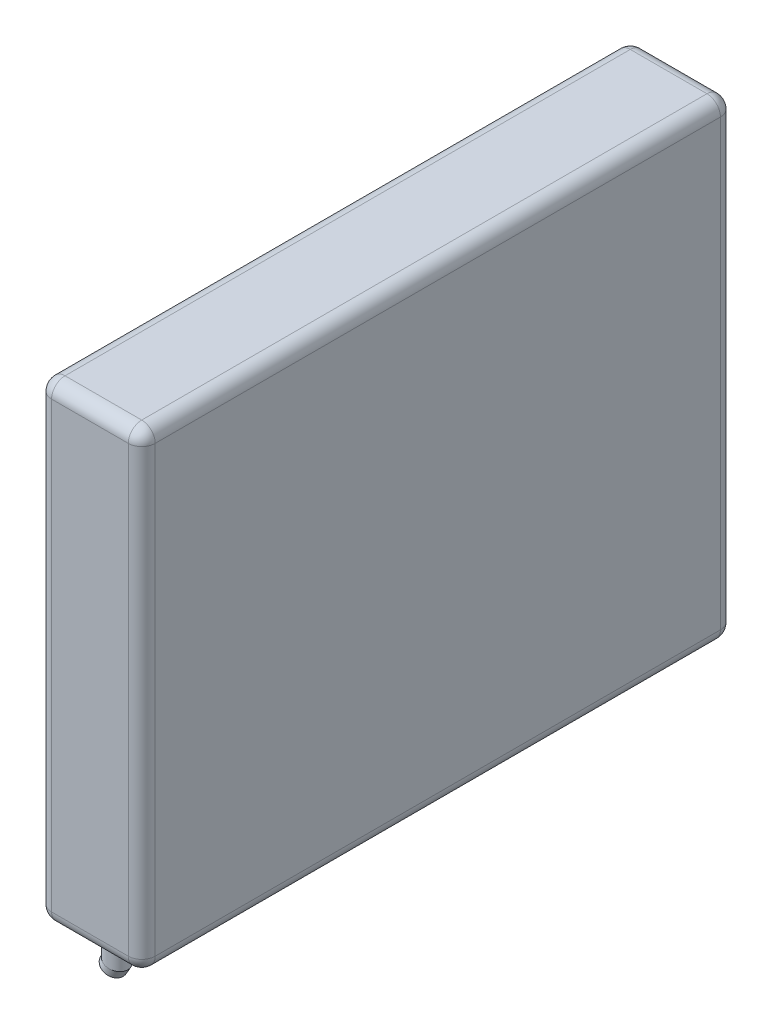
ISO-10303-21;
HEADER;
FILE_DESCRIPTION(('STEP AP214'),'2;1');
FILE_NAME('part.step','',(''),(''),'','','');
FILE_SCHEMA(('AUTOMOTIVE_DESIGN { 1 0 10303 214 1 1 1 1 }'));
ENDSEC;
DATA;
#1=APPLICATION_CONTEXT('core data for automotive mechanical design processes');
#2=APPLICATION_PROTOCOL_DEFINITION('international standard','automotive_design',2000,#1);
#3=PRODUCT_CONTEXT('',#1,'mechanical');
#4=PRODUCT('Part','Part','',(#3));
#5=PRODUCT_RELATED_PRODUCT_CATEGORY('part','',(#4));
#6=PRODUCT_DEFINITION_FORMATION('','',#4);
#7=PRODUCT_DEFINITION_CONTEXT('part definition',#1,'design');
#8=PRODUCT_DEFINITION('design','',#6,#7);
#9=PRODUCT_DEFINITION_SHAPE('','',#8);
#10=(LENGTH_UNIT() NAMED_UNIT(*) SI_UNIT(.MILLI.,.METRE.));
#11=(NAMED_UNIT(*) PLANE_ANGLE_UNIT() SI_UNIT($,.RADIAN.));
#12=(NAMED_UNIT(*) SI_UNIT($,.STERADIAN.) SOLID_ANGLE_UNIT());
#13=UNCERTAINTY_MEASURE_WITH_UNIT(LENGTH_MEASURE(1.E-05),#10,'distance_accuracy_value','');
#14=(GEOMETRIC_REPRESENTATION_CONTEXT(3) GLOBAL_UNCERTAINTY_ASSIGNED_CONTEXT((#13)) GLOBAL_UNIT_ASSIGNED_CONTEXT((#10,
#11,#12)) REPRESENTATION_CONTEXT('',''));
#15=CARTESIAN_POINT('',(0.,0.,0.));
#16=DIRECTION('',(0.,0.,1.));
#17=DIRECTION('',(1.,0.,0.));
#18=AXIS2_PLACEMENT_3D('',#15,#16,#17);
#19=CARTESIAN_POINT('',(1.925,-8.75,-11.));
#20=DIRECTION('',(0.,0.,1.));
#21=DIRECTION('',(0.,-1.,0.));
#22=AXIS2_PLACEMENT_3D('',#19,#20,#21);
#23=PLANE('',#22);
#24=DIRECTION('',(0.,1.,0.));
#25=VECTOR('',#24,1.);
#26=CARTESIAN_POINT('',(1.425,-8.75,-11.));
#27=LINE('',#26,#25);
#28=CARTESIAN_POINT('',(1.425,8.25,-11.));
#29=VERTEX_POINT('',#28);
#30=CARTESIAN_POINT('',(1.425,-8.25,-11.));
#31=VERTEX_POINT('',#30);
#32=EDGE_CURVE('E164',#29,#31,#27,.F.);
#33=ORIENTED_EDGE('',*,*,#32,.T.);
#34=DIRECTION('',(-1.,0.,0.));
#35=VECTOR('',#34,1.);
#36=CARTESIAN_POINT('',(1.925,-8.25,-11.));
#37=LINE('',#36,#35);
#38=CARTESIAN_POINT('',(-1.425,-8.25,-11.));
#39=VERTEX_POINT('',#38);
#40=EDGE_CURVE('E168',#31,#39,#37,.T.);
#41=ORIENTED_EDGE('',*,*,#40,.T.);
#42=DIRECTION('',(0.,1.,0.));
#43=VECTOR('',#42,1.);
#44=CARTESIAN_POINT('',(-1.425,8.75,-11.));
#45=LINE('',#44,#43);
#46=CARTESIAN_POINT('',(-1.425,8.25,-11.));
#47=VERTEX_POINT('',#46);
#48=EDGE_CURVE('E137',#39,#47,#45,.T.);
#49=ORIENTED_EDGE('',*,*,#48,.T.);
#50=DIRECTION('',(-1.,0.,0.));
#51=VECTOR('',#50,1.);
#52=CARTESIAN_POINT('',(1.925,8.25,-11.));
#53=LINE('',#52,#51);
#54=EDGE_CURVE('E158',#47,#29,#53,.F.);
#55=ORIENTED_EDGE('',*,*,#54,.T.);
#56=EDGE_LOOP('',(#33,#41,#49,#55));
#57=FACE_BOUND('',#56,.T.);
#58=ADVANCED_FACE('F39',(#57),#23,.F.);
#59=CARTESIAN_POINT('',(1.925,8.74999999999999,11.));
#60=DIRECTION('',(0.,-1.,0.));
#61=DIRECTION('',(0.,0.,-1.));
#62=AXIS2_PLACEMENT_3D('',#59,#60,#61);
#63=PLANE('',#62);
#64=DIRECTION('',(0.,0.,1.));
#65=VECTOR('',#64,1.);
#66=CARTESIAN_POINT('',(1.425,8.74999999999999,11.));
#67=LINE('',#66,#65);
#68=CARTESIAN_POINT('',(1.425,8.74999999999999,10.5));
#69=VERTEX_POINT('',#68);
#70=CARTESIAN_POINT('',(1.425,8.75,-10.5));
#71=VERTEX_POINT('',#70);
#72=EDGE_CURVE('E193',#69,#71,#67,.F.);
#73=ORIENTED_EDGE('',*,*,#72,.T.);
#74=DIRECTION('',(-1.,0.,0.));
#75=VECTOR('',#74,1.);
#76=CARTESIAN_POINT('',(1.925,8.75,-10.5));
#77=LINE('',#76,#75);
#78=CARTESIAN_POINT('',(-1.425,8.75,-10.5));
#79=VERTEX_POINT('',#78);
#80=EDGE_CURVE('E200',#71,#79,#77,.T.);
#81=ORIENTED_EDGE('',*,*,#80,.T.);
#82=DIRECTION('',(0.,0.,1.));
#83=VECTOR('',#82,1.);
#84=CARTESIAN_POINT('',(-1.425,8.74999999999999,11.));
#85=LINE('',#84,#83);
#86=CARTESIAN_POINT('',(-1.425,8.74999999999999,10.5));
#87=VERTEX_POINT('',#86);
#88=EDGE_CURVE('E196',#79,#87,#85,.T.);
#89=ORIENTED_EDGE('',*,*,#88,.T.);
#90=DIRECTION('',(-1.,0.,0.));
#91=VECTOR('',#90,1.);
#92=CARTESIAN_POINT('',(1.925,8.74999999999999,10.5));
#93=LINE('',#92,#91);
#94=EDGE_CURVE('E190',#87,#69,#93,.F.);
#95=ORIENTED_EDGE('',*,*,#94,.T.);
#96=EDGE_LOOP('',(#73,#81,#89,#95));
#97=FACE_BOUND('',#96,.T.);
#98=ADVANCED_FACE('F370',(#97),#63,.F.);
#99=CARTESIAN_POINT('',(1.925,-8.75000000000001,11.));
#100=DIRECTION('',(0.,0.,-1.));
#101=DIRECTION('',(0.,1.,0.));
#102=AXIS2_PLACEMENT_3D('',#99,#100,#101);
#103=PLANE('',#102);
#104=DIRECTION('',(0.,-1.,0.));
#105=VECTOR('',#104,1.);
#106=CARTESIAN_POINT('',(-1.425,-8.75000000000001,11.));
#107=LINE('',#106,#105);
#108=CARTESIAN_POINT('',(-1.425,8.24999999999999,11.));
#109=VERTEX_POINT('',#108);
#110=CARTESIAN_POINT('',(-1.425,-8.25000000000001,11.));
#111=VERTEX_POINT('',#110);
#112=EDGE_CURVE('E209',#109,#111,#107,.T.);
#113=ORIENTED_EDGE('',*,*,#112,.T.);
#114=DIRECTION('',(-1.,0.,0.));
#115=VECTOR('',#114,1.);
#116=CARTESIAN_POINT('',(1.925,-8.25000000000001,11.));
#117=LINE('',#116,#115);
#118=CARTESIAN_POINT('',(1.425,-8.25000000000001,11.));
#119=VERTEX_POINT('',#118);
#120=EDGE_CURVE('E212',#111,#119,#117,.F.);
#121=ORIENTED_EDGE('',*,*,#120,.T.);
#122=DIRECTION('',(0.,-1.,0.));
#123=VECTOR('',#122,1.);
#124=CARTESIAN_POINT('',(1.425,-8.75000000000001,11.));
#125=LINE('',#124,#123);
#126=CARTESIAN_POINT('',(1.425,8.24999999999999,11.));
#127=VERTEX_POINT('',#126);
#128=EDGE_CURVE('E206',#119,#127,#125,.F.);
#129=ORIENTED_EDGE('',*,*,#128,.T.);
#130=DIRECTION('',(-1.,0.,0.));
#131=VECTOR('',#130,1.);
#132=CARTESIAN_POINT('',(1.925,8.24999999999999,11.));
#133=LINE('',#132,#131);
#134=EDGE_CURVE('E203',#127,#109,#133,.T.);
#135=ORIENTED_EDGE('',*,*,#134,.T.);
#136=EDGE_LOOP('',(#113,#121,#129,#135));
#137=FACE_BOUND('',#136,.T.);
#138=ADVANCED_FACE('F347',(#137),#103,.F.);
#139=CARTESIAN_POINT('',(1.925,-8.75000000000001,11.));
#140=DIRECTION('',(0.,1.,0.));
#141=DIRECTION('',(0.,0.,1.));
#142=AXIS2_PLACEMENT_3D('',#139,#140,#141);
#143=PLANE('',#142);
#144=CARTESIAN_POINT('',(0.,-8.75000000000001,-10.));
#145=DIRECTION('',(0.,1.,0.));
#146=DIRECTION('',(0.,0.,1.));
#147=AXIS2_PLACEMENT_3D('',#144,#145,#146);
#148=CIRCLE('',#147,0.4064);
#149=CARTESIAN_POINT('',(0.,-8.75000000000001,-9.5936));
#150=VERTEX_POINT('',#149);
#151=EDGE_CURVE('E332',#150,#150,#148,.F.);
#152=ORIENTED_EDGE('',*,*,#151,.F.);
#153=EDGE_LOOP('',(#152));
#154=FACE_BOUND('',#153,.T.);
#155=DIRECTION('',(0.,0.,-1.));
#156=VECTOR('',#155,1.);
#157=CARTESIAN_POINT('',(-1.425,-8.75,-11.));
#158=LINE('',#157,#156);
#159=CARTESIAN_POINT('',(-1.425,-8.75000000000001,10.5));
#160=VERTEX_POINT('',#159);
#161=CARTESIAN_POINT('',(-1.425,-8.75,-10.5));
#162=VERTEX_POINT('',#161);
#163=EDGE_CURVE('E220',#160,#162,#158,.T.);
#164=ORIENTED_EDGE('',*,*,#163,.T.);
#165=DIRECTION('',(-1.,0.,0.));
#166=VECTOR('',#165,1.);
#167=CARTESIAN_POINT('',(1.925,-8.75,-10.5));
#168=LINE('',#167,#166);
#169=CARTESIAN_POINT('',(1.425,-8.75,-10.5));
#170=VERTEX_POINT('',#169);
#171=EDGE_CURVE('E224',#162,#170,#168,.F.);
#172=ORIENTED_EDGE('',*,*,#171,.T.);
#173=DIRECTION('',(0.,0.,-1.));
#174=VECTOR('',#173,1.);
#175=CARTESIAN_POINT('',(1.425,-8.75000000000001,11.));
#176=LINE('',#175,#174);
#177=CARTESIAN_POINT('',(1.425,-8.75000000000001,10.5));
#178=VERTEX_POINT('',#177);
#179=EDGE_CURVE('E218',#170,#178,#176,.F.);
#180=ORIENTED_EDGE('',*,*,#179,.T.);
#181=DIRECTION('',(-1.,0.,0.));
#182=VECTOR('',#181,1.);
#183=CARTESIAN_POINT('',(1.925,-8.75000000000001,10.5));
#184=LINE('',#183,#182);
#185=EDGE_CURVE('E215',#178,#160,#184,.T.);
#186=ORIENTED_EDGE('',*,*,#185,.T.);
#187=EDGE_LOOP('',(#164,#172,#180,#186));
#188=FACE_BOUND('',#187,.T.);
#189=CARTESIAN_POINT('',(0.,-8.75000000000001,10.));
#190=DIRECTION('',(0.,-1.,0.));
#191=DIRECTION('',(0.,0.,-1.));
#192=AXIS2_PLACEMENT_3D('',#189,#190,#191);
#193=CIRCLE('',#192,0.4064);
#194=CARTESIAN_POINT('',(0.,-8.75000000000001,9.5936));
#195=VERTEX_POINT('',#194);
#196=EDGE_CURVE('E317',#195,#195,#193,.T.);
#197=ORIENTED_EDGE('',*,*,#196,.F.);
#198=EDGE_LOOP('',(#197));
#199=FACE_BOUND('',#198,.T.);
#200=ADVANCED_FACE('F343',(#154,#188,#199),#143,.F.);
#201=CARTESIAN_POINT('',(1.925,0.,0.));
#202=DIRECTION('',(-1.,0.,0.));
#203=DIRECTION('',(0.,0.,1.));
#204=AXIS2_PLACEMENT_3D('',#201,#202,#203);
#205=PLANE('',#204);
#206=DIRECTION('',(0.,0.,-1.));
#207=VECTOR('',#206,1.);
#208=CARTESIAN_POINT('',(1.925,-8.25000000000001,0.));
#209=LINE('',#208,#207);
#210=CARTESIAN_POINT('',(1.925,-8.25000000000001,10.5));
#211=VERTEX_POINT('',#210);
#212=CARTESIAN_POINT('',(1.925,-8.25,-10.5));
#213=VERTEX_POINT('',#212);
#214=EDGE_CURVE('E227',#211,#213,#209,.T.);
#215=ORIENTED_EDGE('',*,*,#214,.T.);
#216=DIRECTION('',(0.,1.,0.));
#217=VECTOR('',#216,1.);
#218=CARTESIAN_POINT('',(1.925,0.,-10.5));
#219=LINE('',#218,#217);
#220=CARTESIAN_POINT('',(1.925,8.25,-10.5));
#221=VERTEX_POINT('',#220);
#222=EDGE_CURVE('E11',#213,#221,#219,.T.);
#223=ORIENTED_EDGE('',*,*,#222,.T.);
#224=DIRECTION('',(0.,0.,1.));
#225=VECTOR('',#224,1.);
#226=CARTESIAN_POINT('',(1.925,8.25,0.));
#227=LINE('',#226,#225);
#228=CARTESIAN_POINT('',(1.925,8.24999999999999,10.5));
#229=VERTEX_POINT('',#228);
#230=EDGE_CURVE('E49',#221,#229,#227,.T.);
#231=ORIENTED_EDGE('',*,*,#230,.T.);
#232=DIRECTION('',(0.,-1.,0.));
#233=VECTOR('',#232,1.);
#234=CARTESIAN_POINT('',(1.925,0.,10.5));
#235=LINE('',#234,#233);
#236=EDGE_CURVE('E230',#229,#211,#235,.T.);
#237=ORIENTED_EDGE('',*,*,#236,.T.);
#238=EDGE_LOOP('',(#215,#223,#231,#237));
#239=FACE_BOUND('',#238,.T.);
#240=ADVANCED_FACE('F346',(#239),#205,.F.);
#241=CARTESIAN_POINT('',(-1.925,0.,0.));
#242=DIRECTION('',(-1.,0.,0.));
#243=DIRECTION('',(0.,0.,1.));
#244=AXIS2_PLACEMENT_3D('',#241,#242,#243);
#245=PLANE('',#244);
#246=DIRECTION('',(0.,0.,1.));
#247=VECTOR('',#246,1.);
#248=CARTESIAN_POINT('',(-1.925,8.25,-11.));
#249=LINE('',#248,#247);
#250=CARTESIAN_POINT('',(-1.925,8.24999999999999,10.5));
#251=VERTEX_POINT('',#250);
#252=CARTESIAN_POINT('',(-1.925,8.25,-10.5));
#253=VERTEX_POINT('',#252);
#254=EDGE_CURVE('E185',#251,#253,#249,.F.);
#255=ORIENTED_EDGE('',*,*,#254,.T.);
#256=DIRECTION('',(0.,1.,0.));
#257=VECTOR('',#256,1.);
#258=CARTESIAN_POINT('',(-1.925,-8.75,-10.5));
#259=LINE('',#258,#257);
#260=CARTESIAN_POINT('',(-1.925,-8.25,-10.5));
#261=VERTEX_POINT('',#260);
#262=EDGE_CURVE('E139',#253,#261,#259,.F.);
#263=ORIENTED_EDGE('',*,*,#262,.T.);
#264=DIRECTION('',(0.,0.,-1.));
#265=VECTOR('',#264,1.);
#266=CARTESIAN_POINT('',(-1.925,-8.25000000000001,11.));
#267=LINE('',#266,#265);
#268=CARTESIAN_POINT('',(-1.925,-8.25000000000001,10.5));
#269=VERTEX_POINT('',#268);
#270=EDGE_CURVE('E175',#261,#269,#267,.F.);
#271=ORIENTED_EDGE('',*,*,#270,.T.);
#272=DIRECTION('',(0.,-1.,0.));
#273=VECTOR('',#272,1.);
#274=CARTESIAN_POINT('',(-1.925,8.74999999999999,10.5));
#275=LINE('',#274,#273);
#276=EDGE_CURVE('E182',#269,#251,#275,.F.);
#277=ORIENTED_EDGE('',*,*,#276,.T.);
#278=EDGE_LOOP('',(#255,#263,#271,#277));
#279=FACE_BOUND('',#278,.T.);
#280=ADVANCED_FACE('F358',(#279),#245,.T.);
#281=CARTESIAN_POINT('',(-0.118311477848357,-9.79309210460607,10.));
#282=DIRECTION('',(-0.500000000000002,-0.866025403784438,0.));
#283=DIRECTION('',(0.,0.,-1.));
#284=AXIS2_PLACEMENT_3D('',#281,#282,#283);
#285=PLANE('',#284);
#286=CARTESIAN_POINT('',(-0.118311477848357,-9.79309210460607,10.));
#287=DIRECTION('',(-0.500000000000002,-0.866025403784438,0.));
#288=DIRECTION('',(0.,0.,-1.));
#289=AXIS2_PLACEMENT_3D('',#286,#287,#288);
#290=CIRCLE('',#289,0.4064);
#291=CARTESIAN_POINT('',(-0.118311477848357,-9.79309210460607,9.5936));
#292=VERTEX_POINT('',#291);
#293=EDGE_CURVE('E310',#292,#292,#290,.T.);
#294=ORIENTED_EDGE('',*,*,#293,.T.);
#295=EDGE_LOOP('',(#294));
#296=FACE_BOUND('',#295,.T.);
#297=ADVANCED_FACE('F363',(#296),#285,.T.);
#298=CARTESIAN_POINT('',(0.16978400698441,-9.29409608744453,10.));
#299=DIRECTION('',(-0.500000000000002,-0.866025403784438,0.));
#300=DIRECTION('',(0.866025403784438,-0.500000000000002,0.));
#301=AXIS2_PLACEMENT_3D('',#298,#299,#300);
#302=CYLINDRICAL_SURFACE('',#301,0.4064);
#303=CARTESIAN_POINT('',(0.,-9.58817061385415,10.));
#304=DIRECTION('',(-0.258819045102522,-0.965925826289068,0.));
#305=DIRECTION('',(0.965925826289068,-0.258819045102522,0.));
#306=AXIS2_PLACEMENT_3D('',#303,#304,#305);
#307=ELLIPSE('',#306,0.420736239718658,0.4064);
#308=CARTESIAN_POINT('',(0.4064,-9.69706516565816,10.));
#309=VERTEX_POINT('',#308);
#310=EDGE_CURVE('E165',#309,#309,#307,.F.);
#311=ORIENTED_EDGE('',*,*,#310,.F.);
#312=EDGE_LOOP('',(#311));
#313=FACE_BOUND('',#312,.T.);
#314=ORIENTED_EDGE('',*,*,#293,.F.);
#315=EDGE_LOOP('',(#314));
#316=FACE_BOUND('',#315,.T.);
#317=ADVANCED_FACE('F356',(#313,#316),#302,.T.);
#318=CARTESIAN_POINT('',(0.,-8.75000000000001,10.));
#319=DIRECTION('',(0.,-1.,0.));
#320=DIRECTION('',(0.,0.,-1.));
#321=AXIS2_PLACEMENT_3D('',#318,#319,#320);
#322=CYLINDRICAL_SURFACE('',#321,0.4064);
#323=ORIENTED_EDGE('',*,*,#196,.T.);
#324=EDGE_LOOP('',(#323));
#325=FACE_BOUND('',#324,.T.);
#326=ORIENTED_EDGE('',*,*,#310,.T.);
#327=EDGE_LOOP('',(#326));
#328=FACE_BOUND('',#327,.T.);
#329=ADVANCED_FACE('F353',(#325,#328),#322,.T.);
#330=CARTESIAN_POINT('',(1.425,0.,10.5));
#331=DIRECTION('',(0.,-1.,0.));
#332=DIRECTION('',(0.,0.,-1.));
#333=AXIS2_PLACEMENT_3D('',#330,#331,#332);
#334=CYLINDRICAL_SURFACE('',#333,0.5);
#335=CARTESIAN_POINT('',(1.425,-8.25000000000001,10.5));
#336=DIRECTION('',(0.,-1.,0.));
#337=DIRECTION('',(0.,0.,-1.));
#338=AXIS2_PLACEMENT_3D('',#335,#336,#337);
#339=CIRCLE('',#338,0.5);
#340=EDGE_CURVE('E43',#211,#119,#339,.T.);
#341=ORIENTED_EDGE('',*,*,#340,.F.);
#342=ORIENTED_EDGE('',*,*,#236,.F.);
#343=CARTESIAN_POINT('',(1.425,8.24999999999999,10.5));
#344=DIRECTION('',(0.,1.,0.));
#345=DIRECTION('',(-1.,0.,0.));
#346=AXIS2_PLACEMENT_3D('',#343,#344,#345);
#347=CIRCLE('',#346,0.5);
#348=EDGE_CURVE('E301',#127,#229,#347,.T.);
#349=ORIENTED_EDGE('',*,*,#348,.F.);
#350=ORIENTED_EDGE('',*,*,#128,.F.);
#351=EDGE_LOOP('',(#341,#342,#349,#350));
#352=FACE_BOUND('',#351,.T.);
#353=ADVANCED_FACE('F41',(#352),#334,.T.);
#354=CARTESIAN_POINT('',(1.425,-8.25000000000001,10.5));
#355=DIRECTION('',(0.,0.,1.));
#356=DIRECTION('',(1.,0.,0.));
#357=AXIS2_PLACEMENT_3D('',#354,#355,#356);
#358=SPHERICAL_SURFACE('',#357,0.5);
#359=CARTESIAN_POINT('',(1.425,-8.25000000000001,10.5));
#360=DIRECTION('',(0.,0.,1.));
#361=DIRECTION('',(1.,0.,0.));
#362=AXIS2_PLACEMENT_3D('',#359,#360,#361);
#363=CIRCLE('',#362,0.5);
#364=EDGE_CURVE('E294',#211,#178,#363,.F.);
#365=ORIENTED_EDGE('',*,*,#364,.F.);
#366=ORIENTED_EDGE('',*,*,#340,.T.);
#367=CARTESIAN_POINT('',(1.425,-8.25000000000001,10.5));
#368=DIRECTION('',(1.,0.,0.));
#369=DIRECTION('',(0.,0.,-1.));
#370=AXIS2_PLACEMENT_3D('',#367,#368,#369);
#371=CIRCLE('',#370,0.5);
#372=EDGE_CURVE('E298',#178,#119,#371,.F.);
#373=ORIENTED_EDGE('',*,*,#372,.F.);
#374=EDGE_LOOP('',(#365,#366,#373));
#375=FACE_BOUND('',#374,.T.);
#376=ADVANCED_FACE('F443',(#375),#358,.T.);
#377=CARTESIAN_POINT('',(1.425,8.24999999999999,10.5));
#378=DIRECTION('',(0.,0.,1.));
#379=DIRECTION('',(1.,0.,0.));
#380=AXIS2_PLACEMENT_3D('',#377,#378,#379);
#381=SPHERICAL_SURFACE('',#380,0.5);
#382=CARTESIAN_POINT('',(1.425,8.24999999999999,10.5));
#383=DIRECTION('',(1.,0.,0.));
#384=DIRECTION('',(0.,0.,-1.));
#385=AXIS2_PLACEMENT_3D('',#382,#383,#384);
#386=CIRCLE('',#385,0.5);
#387=EDGE_CURVE('E286',#127,#69,#386,.F.);
#388=ORIENTED_EDGE('',*,*,#387,.F.);
#389=ORIENTED_EDGE('',*,*,#348,.T.);
#390=CARTESIAN_POINT('',(1.425,8.24999999999999,10.5));
#391=DIRECTION('',(0.,0.,1.));
#392=DIRECTION('',(1.,0.,0.));
#393=AXIS2_PLACEMENT_3D('',#390,#391,#392);
#394=CIRCLE('',#393,0.5);
#395=EDGE_CURVE('E290',#69,#229,#394,.F.);
#396=ORIENTED_EDGE('',*,*,#395,.F.);
#397=EDGE_LOOP('',(#388,#389,#396));
#398=FACE_BOUND('',#397,.T.);
#399=ADVANCED_FACE('F440',(#398),#381,.T.);
#400=CARTESIAN_POINT('',(1.925,-8.25000000000001,10.5));
#401=DIRECTION('',(-1.,0.,0.));
#402=DIRECTION('',(0.,0.,1.));
#403=AXIS2_PLACEMENT_3D('',#400,#401,#402);
#404=CYLINDRICAL_SURFACE('',#403,0.5);
#405=ORIENTED_EDGE('',*,*,#372,.T.);
#406=ORIENTED_EDGE('',*,*,#120,.F.);
#407=CARTESIAN_POINT('',(-1.425,-8.25000000000001,10.5));
#408=DIRECTION('',(-1.,0.,0.));
#409=DIRECTION('',(0.,0.,1.));
#410=AXIS2_PLACEMENT_3D('',#407,#408,#409);
#411=CIRCLE('',#410,0.5);
#412=EDGE_CURVE('E279',#160,#111,#411,.T.);
#413=ORIENTED_EDGE('',*,*,#412,.F.);
#414=ORIENTED_EDGE('',*,*,#185,.F.);
#415=EDGE_LOOP('',(#405,#406,#413,#414));
#416=FACE_BOUND('',#415,.T.);
#417=ADVANCED_FACE('F436',(#416),#404,.T.);
#418=CARTESIAN_POINT('',(1.425,-8.25000000000001,0.));
#419=DIRECTION('',(0.,0.,-1.));
#420=DIRECTION('',(0.,1.,0.));
#421=AXIS2_PLACEMENT_3D('',#418,#419,#420);
#422=CYLINDRICAL_SURFACE('',#421,0.5);
#423=ORIENTED_EDGE('',*,*,#364,.T.);
#424=ORIENTED_EDGE('',*,*,#179,.F.);
#425=CARTESIAN_POINT('',(1.425,-8.25,-10.5));
#426=DIRECTION('',(0.,0.,-1.));
#427=DIRECTION('',(-1.,0.,0.));
#428=AXIS2_PLACEMENT_3D('',#425,#426,#427);
#429=CIRCLE('',#428,0.5);
#430=EDGE_CURVE('E275',#213,#170,#429,.T.);
#431=ORIENTED_EDGE('',*,*,#430,.F.);
#432=ORIENTED_EDGE('',*,*,#214,.F.);
#433=EDGE_LOOP('',(#423,#424,#431,#432));
#434=FACE_BOUND('',#433,.T.);
#435=ADVANCED_FACE('F432',(#434),#422,.T.);
#436=CARTESIAN_POINT('',(1.425,0.,-10.5));
#437=DIRECTION('',(0.,1.,0.));
#438=DIRECTION('',(0.,0.,1.));
#439=AXIS2_PLACEMENT_3D('',#436,#437,#438);
#440=CYLINDRICAL_SURFACE('',#439,0.5);
#441=CARTESIAN_POINT('',(1.425,8.25,-10.5));
#442=DIRECTION('',(0.,1.,0.));
#443=DIRECTION('',(0.,0.,1.));
#444=AXIS2_PLACEMENT_3D('',#441,#442,#443);
#445=CIRCLE('',#444,0.5);
#446=EDGE_CURVE('E268',#221,#29,#445,.T.);
#447=ORIENTED_EDGE('',*,*,#446,.F.);
#448=ORIENTED_EDGE('',*,*,#222,.F.);
#449=CARTESIAN_POINT('',(1.425,-8.25,-10.5));
#450=DIRECTION('',(0.,-1.,0.));
#451=DIRECTION('',(0.,0.,-1.));
#452=AXIS2_PLACEMENT_3D('',#449,#450,#451);
#453=CIRCLE('',#452,0.5);
#454=EDGE_CURVE('E271',#31,#213,#453,.T.);
#455=ORIENTED_EDGE('',*,*,#454,.F.);
#456=ORIENTED_EDGE('',*,*,#32,.F.);
#457=EDGE_LOOP('',(#447,#448,#455,#456));
#458=FACE_BOUND('',#457,.T.);
#459=ADVANCED_FACE('F428',(#458),#440,.T.);
#460=CARTESIAN_POINT('',(1.425,8.25,0.));
#461=DIRECTION('',(0.,0.,1.));
#462=DIRECTION('',(0.,-1.,0.));
#463=AXIS2_PLACEMENT_3D('',#460,#461,#462);
#464=CYLINDRICAL_SURFACE('',#463,0.5);
#465=ORIENTED_EDGE('',*,*,#395,.T.);
#466=ORIENTED_EDGE('',*,*,#230,.F.);
#467=CARTESIAN_POINT('',(1.425,8.25,-10.5));
#468=DIRECTION('',(0.,0.,-1.));
#469=DIRECTION('',(-1.,0.,0.));
#470=AXIS2_PLACEMENT_3D('',#467,#468,#469);
#471=CIRCLE('',#470,0.5);
#472=EDGE_CURVE('E57',#71,#221,#471,.T.);
#473=ORIENTED_EDGE('',*,*,#472,.F.);
#474=ORIENTED_EDGE('',*,*,#72,.F.);
#475=EDGE_LOOP('',(#465,#466,#473,#474));
#476=FACE_BOUND('',#475,.T.);
#477=ADVANCED_FACE('F424',(#476),#464,.T.);
#478=CARTESIAN_POINT('',(1.925,8.24999999999999,10.5));
#479=DIRECTION('',(-1.,0.,0.));
#480=DIRECTION('',(0.,0.,1.));
#481=AXIS2_PLACEMENT_3D('',#478,#479,#480);
#482=CYLINDRICAL_SURFACE('',#481,0.5);
#483=ORIENTED_EDGE('',*,*,#387,.T.);
#484=ORIENTED_EDGE('',*,*,#94,.F.);
#485=CARTESIAN_POINT('',(-1.425,8.24999999999999,10.5));
#486=DIRECTION('',(-1.,0.,0.));
#487=DIRECTION('',(0.,0.,1.));
#488=AXIS2_PLACEMENT_3D('',#485,#486,#487);
#489=CIRCLE('',#488,0.5);
#490=EDGE_CURVE('E262',#109,#87,#489,.T.);
#491=ORIENTED_EDGE('',*,*,#490,.F.);
#492=ORIENTED_EDGE('',*,*,#134,.F.);
#493=EDGE_LOOP('',(#483,#484,#491,#492));
#494=FACE_BOUND('',#493,.T.);
#495=ADVANCED_FACE('F420',(#494),#482,.T.);
#496=CARTESIAN_POINT('',(-1.425,-8.75000000000001,10.5));
#497=DIRECTION('',(0.,1.,0.));
#498=DIRECTION('',(0.,0.,1.));
#499=AXIS2_PLACEMENT_3D('',#496,#497,#498);
#500=CYLINDRICAL_SURFACE('',#499,0.5);
#501=CARTESIAN_POINT('',(-1.425,-8.25000000000001,10.5));
#502=DIRECTION('',(0.,-1.,0.));
#503=DIRECTION('',(0.,0.,-1.));
#504=AXIS2_PLACEMENT_3D('',#501,#502,#503);
#505=CIRCLE('',#504,0.5);
#506=EDGE_CURVE('E282',#111,#269,#505,.T.);
#507=ORIENTED_EDGE('',*,*,#506,.F.);
#508=ORIENTED_EDGE('',*,*,#112,.F.);
#509=CARTESIAN_POINT('',(-1.425,8.24999999999999,10.5));
#510=DIRECTION('',(0.,1.,0.));
#511=DIRECTION('',(0.,0.,1.));
#512=AXIS2_PLACEMENT_3D('',#509,#510,#511);
#513=CIRCLE('',#512,0.5);
#514=EDGE_CURVE('E258',#251,#109,#513,.T.);
#515=ORIENTED_EDGE('',*,*,#514,.F.);
#516=ORIENTED_EDGE('',*,*,#276,.F.);
#517=EDGE_LOOP('',(#507,#508,#515,#516));
#518=FACE_BOUND('',#517,.T.);
#519=ADVANCED_FACE('F416',(#518),#500,.T.);
#520=CARTESIAN_POINT('',(-1.425,-8.25000000000001,10.5));
#521=DIRECTION('',(0.,0.,1.));
#522=DIRECTION('',(1.,0.,0.));
#523=AXIS2_PLACEMENT_3D('',#520,#521,#522);
#524=SPHERICAL_SURFACE('',#523,0.5);
#525=ORIENTED_EDGE('',*,*,#412,.T.);
#526=ORIENTED_EDGE('',*,*,#506,.T.);
#527=CARTESIAN_POINT('',(-1.425,-8.25000000000001,10.5));
#528=DIRECTION('',(0.,0.,1.));
#529=DIRECTION('',(1.,0.,0.));
#530=AXIS2_PLACEMENT_3D('',#527,#528,#529);
#531=CIRCLE('',#530,0.5);
#532=EDGE_CURVE('E254',#160,#269,#531,.F.);
#533=ORIENTED_EDGE('',*,*,#532,.F.);
#534=EDGE_LOOP('',(#525,#526,#533));
#535=FACE_BOUND('',#534,.T.);
#536=ADVANCED_FACE('F412',(#535),#524,.T.);
#537=CARTESIAN_POINT('',(1.425,-8.25,-10.5));
#538=DIRECTION('',(0.,0.,1.));
#539=DIRECTION('',(1.,0.,0.));
#540=AXIS2_PLACEMENT_3D('',#537,#538,#539);
#541=SPHERICAL_SURFACE('',#540,0.5);
#542=ORIENTED_EDGE('',*,*,#454,.T.);
#543=ORIENTED_EDGE('',*,*,#430,.T.);
#544=CARTESIAN_POINT('',(1.425,-8.25,-10.5));
#545=DIRECTION('',(1.,0.,0.));
#546=DIRECTION('',(0.,0.,-1.));
#547=AXIS2_PLACEMENT_3D('',#544,#545,#546);
#548=CIRCLE('',#547,0.5);
#549=EDGE_CURVE('E250',#31,#170,#548,.F.);
#550=ORIENTED_EDGE('',*,*,#549,.F.);
#551=EDGE_LOOP('',(#542,#543,#550));
#552=FACE_BOUND('',#551,.T.);
#553=ADVANCED_FACE('F409',(#552),#541,.T.);
#554=CARTESIAN_POINT('',(1.425,8.25,-10.5));
#555=DIRECTION('',(0.,0.,1.));
#556=DIRECTION('',(1.,0.,0.));
#557=AXIS2_PLACEMENT_3D('',#554,#555,#556);
#558=SPHERICAL_SURFACE('',#557,0.5);
#559=ORIENTED_EDGE('',*,*,#472,.T.);
#560=ORIENTED_EDGE('',*,*,#446,.T.);
#561=CARTESIAN_POINT('',(1.425,8.25,-10.5));
#562=DIRECTION('',(1.,0.,0.));
#563=DIRECTION('',(0.,0.,-1.));
#564=AXIS2_PLACEMENT_3D('',#561,#562,#563);
#565=CIRCLE('',#564,0.5);
#566=EDGE_CURVE('E160',#71,#29,#565,.F.);
#567=ORIENTED_EDGE('',*,*,#566,.F.);
#568=EDGE_LOOP('',(#559,#560,#567));
#569=FACE_BOUND('',#568,.T.);
#570=ADVANCED_FACE('F405',(#569),#558,.T.);
#571=CARTESIAN_POINT('',(-1.425,8.24999999999999,10.5));
#572=DIRECTION('',(0.,0.,1.));
#573=DIRECTION('',(1.,0.,0.));
#574=AXIS2_PLACEMENT_3D('',#571,#572,#573);
#575=SPHERICAL_SURFACE('',#574,0.5);
#576=ORIENTED_EDGE('',*,*,#514,.T.);
#577=ORIENTED_EDGE('',*,*,#490,.T.);
#578=CARTESIAN_POINT('',(-1.425,8.24999999999999,10.5));
#579=DIRECTION('',(0.,0.,1.));
#580=DIRECTION('',(1.,0.,0.));
#581=AXIS2_PLACEMENT_3D('',#578,#579,#580);
#582=CIRCLE('',#581,0.5);
#583=EDGE_CURVE('E245',#251,#87,#582,.F.);
#584=ORIENTED_EDGE('',*,*,#583,.F.);
#585=EDGE_LOOP('',(#576,#577,#584));
#586=FACE_BOUND('',#585,.T.);
#587=ADVANCED_FACE('F401',(#586),#575,.T.);
#588=CARTESIAN_POINT('',(-1.425,-8.25000000000001,11.));
#589=DIRECTION('',(0.,0.,1.));
#590=DIRECTION('',(0.,-1.,0.));
#591=AXIS2_PLACEMENT_3D('',#588,#589,#590);
#592=CYLINDRICAL_SURFACE('',#591,0.5);
#593=ORIENTED_EDGE('',*,*,#532,.T.);
#594=ORIENTED_EDGE('',*,*,#270,.F.);
#595=CARTESIAN_POINT('',(-1.425,-8.25,-10.5));
#596=DIRECTION('',(0.,0.,-1.));
#597=DIRECTION('',(-1.,0.,0.));
#598=AXIS2_PLACEMENT_3D('',#595,#596,#597);
#599=CIRCLE('',#598,0.5);
#600=EDGE_CURVE('E241',#162,#261,#599,.T.);
#601=ORIENTED_EDGE('',*,*,#600,.F.);
#602=ORIENTED_EDGE('',*,*,#163,.F.);
#603=EDGE_LOOP('',(#593,#594,#601,#602));
#604=FACE_BOUND('',#603,.T.);
#605=ADVANCED_FACE('F397',(#604),#592,.T.);
#606=CARTESIAN_POINT('',(1.925,-8.25,-10.5));
#607=DIRECTION('',(-1.,0.,0.));
#608=DIRECTION('',(0.,0.,1.));
#609=AXIS2_PLACEMENT_3D('',#606,#607,#608);
#610=CYLINDRICAL_SURFACE('',#609,0.5);
#611=ORIENTED_EDGE('',*,*,#549,.T.);
#612=ORIENTED_EDGE('',*,*,#171,.F.);
#613=CARTESIAN_POINT('',(-1.425,-8.25,-10.5));
#614=DIRECTION('',(-1.,0.,0.));
#615=DIRECTION('',(0.,0.,1.));
#616=AXIS2_PLACEMENT_3D('',#613,#614,#615);
#617=CIRCLE('',#616,0.5);
#618=EDGE_CURVE('E155',#39,#162,#617,.T.);
#619=ORIENTED_EDGE('',*,*,#618,.F.);
#620=ORIENTED_EDGE('',*,*,#40,.F.);
#621=EDGE_LOOP('',(#611,#612,#619,#620));
#622=FACE_BOUND('',#621,.T.);
#623=ADVANCED_FACE('F394',(#622),#610,.T.);
#624=CARTESIAN_POINT('',(1.925,8.25,-10.5));
#625=DIRECTION('',(-1.,0.,0.));
#626=DIRECTION('',(0.,0.,1.));
#627=AXIS2_PLACEMENT_3D('',#624,#625,#626);
#628=CYLINDRICAL_SURFACE('',#627,0.5);
#629=ORIENTED_EDGE('',*,*,#566,.T.);
#630=ORIENTED_EDGE('',*,*,#54,.F.);
#631=CARTESIAN_POINT('',(-1.425,8.25,-10.5));
#632=DIRECTION('',(-1.,0.,0.));
#633=DIRECTION('',(0.,0.,1.));
#634=AXIS2_PLACEMENT_3D('',#631,#632,#633);
#635=CIRCLE('',#634,0.5);
#636=EDGE_CURVE('E147',#79,#47,#635,.T.);
#637=ORIENTED_EDGE('',*,*,#636,.F.);
#638=ORIENTED_EDGE('',*,*,#80,.F.);
#639=EDGE_LOOP('',(#629,#630,#637,#638));
#640=FACE_BOUND('',#639,.T.);
#641=ADVANCED_FACE('F159',(#640),#628,.T.);
#642=CARTESIAN_POINT('',(-1.425,8.24999999999999,11.));
#643=DIRECTION('',(0.,0.,-1.));
#644=DIRECTION('',(0.,1.,0.));
#645=AXIS2_PLACEMENT_3D('',#642,#643,#644);
#646=CYLINDRICAL_SURFACE('',#645,0.5);
#647=ORIENTED_EDGE('',*,*,#583,.T.);
#648=ORIENTED_EDGE('',*,*,#88,.F.);
#649=CARTESIAN_POINT('',(-1.425,8.25,-10.5));
#650=DIRECTION('',(0.,0.,-1.));
#651=DIRECTION('',(0.,1.,0.));
#652=AXIS2_PLACEMENT_3D('',#649,#650,#651);
#653=CIRCLE('',#652,0.5);
#654=EDGE_CURVE('E151',#253,#79,#653,.T.);
#655=ORIENTED_EDGE('',*,*,#654,.F.);
#656=ORIENTED_EDGE('',*,*,#254,.F.);
#657=EDGE_LOOP('',(#647,#648,#655,#656));
#658=FACE_BOUND('',#657,.T.);
#659=ADVANCED_FACE('F387',(#658),#646,.T.);
#660=CARTESIAN_POINT('',(-1.425,-8.25,-10.5));
#661=DIRECTION('',(0.,0.,1.));
#662=DIRECTION('',(1.,0.,0.));
#663=AXIS2_PLACEMENT_3D('',#660,#661,#662);
#664=SPHERICAL_SURFACE('',#663,0.5);
#665=ORIENTED_EDGE('',*,*,#618,.T.);
#666=ORIENTED_EDGE('',*,*,#600,.T.);
#667=CARTESIAN_POINT('',(-1.425,-8.25,-10.5));
#668=DIRECTION('',(0.,-1.,0.));
#669=DIRECTION('',(0.,0.,-1.));
#670=AXIS2_PLACEMENT_3D('',#667,#668,#669);
#671=CIRCLE('',#670,0.5);
#672=EDGE_CURVE('E143',#39,#261,#671,.F.);
#673=ORIENTED_EDGE('',*,*,#672,.F.);
#674=EDGE_LOOP('',(#665,#666,#673));
#675=FACE_BOUND('',#674,.T.);
#676=ADVANCED_FACE('F384',(#675),#664,.T.);
#677=CARTESIAN_POINT('',(-1.425,8.25,-10.5));
#678=DIRECTION('',(0.,0.,1.));
#679=DIRECTION('',(1.,0.,0.));
#680=AXIS2_PLACEMENT_3D('',#677,#678,#679);
#681=SPHERICAL_SURFACE('',#680,0.5);
#682=ORIENTED_EDGE('',*,*,#654,.T.);
#683=ORIENTED_EDGE('',*,*,#636,.T.);
#684=CARTESIAN_POINT('',(-1.425,8.25,-10.5));
#685=DIRECTION('',(0.,1.,0.));
#686=DIRECTION('',(0.,0.,1.));
#687=AXIS2_PLACEMENT_3D('',#684,#685,#686);
#688=CIRCLE('',#687,0.5);
#689=EDGE_CURVE('E133',#253,#47,#688,.F.);
#690=ORIENTED_EDGE('',*,*,#689,.F.);
#691=EDGE_LOOP('',(#682,#683,#690));
#692=FACE_BOUND('',#691,.T.);
#693=ADVANCED_FACE('F149',(#692),#681,.T.);
#694=CARTESIAN_POINT('',(-1.425,-8.75,-10.5));
#695=DIRECTION('',(0.,-1.,0.));
#696=DIRECTION('',(0.,0.,-1.));
#697=AXIS2_PLACEMENT_3D('',#694,#695,#696);
#698=CYLINDRICAL_SURFACE('',#697,0.5);
#699=ORIENTED_EDGE('',*,*,#672,.T.);
#700=ORIENTED_EDGE('',*,*,#262,.F.);
#701=ORIENTED_EDGE('',*,*,#689,.T.);
#702=ORIENTED_EDGE('',*,*,#48,.F.);
#703=EDGE_LOOP('',(#699,#700,#701,#702));
#704=FACE_BOUND('',#703,.T.);
#705=ADVANCED_FACE('F135',(#704),#698,.T.);
#706=CARTESIAN_POINT('',(-0.118311477848357,-9.79309210460607,-10.));
#707=DIRECTION('',(-0.500000000000002,-0.866025403784438,0.));
#708=DIRECTION('',(0.,0.,1.));
#709=AXIS2_PLACEMENT_3D('',#706,#707,#708);
#710=PLANE('',#709);
#711=CARTESIAN_POINT('',(-0.118311477848357,-9.79309210460607,-10.));
#712=DIRECTION('',(0.500000000000002,0.866025403784438,0.));
#713=DIRECTION('',(0.,0.,1.));
#714=AXIS2_PLACEMENT_3D('',#711,#712,#713);
#715=CIRCLE('',#714,0.4064);
#716=CARTESIAN_POINT('',(-0.118311477848357,-9.79309210460607,-9.5936));
#717=VERTEX_POINT('',#716);
#718=EDGE_CURVE('E328',#717,#717,#715,.F.);
#719=ORIENTED_EDGE('',*,*,#718,.T.);
#720=EDGE_LOOP('',(#719));
#721=FACE_BOUND('',#720,.T.);
#722=ADVANCED_FACE('F381',(#721),#710,.T.);
#723=CARTESIAN_POINT('',(0.16978400698441,-9.29409608744453,-10.));
#724=DIRECTION('',(-0.500000000000002,-0.866025403784438,0.));
#725=DIRECTION('',(0.866025403784438,-0.500000000000002,0.));
#726=AXIS2_PLACEMENT_3D('',#723,#724,#725);
#727=CYLINDRICAL_SURFACE('',#726,0.4064);
#728=CARTESIAN_POINT('',(0.,-9.58817061385415,-10.));
#729=DIRECTION('',(-0.258819045102522,-0.965925826289068,0.));
#730=DIRECTION('',(0.965925826289068,-0.258819045102522,0.));
#731=AXIS2_PLACEMENT_3D('',#728,#729,#730);
#732=ELLIPSE('',#731,0.420736239718658,0.4064);
#733=CARTESIAN_POINT('',(0.4064,-9.69706516565816,-10.));
#734=VERTEX_POINT('',#733);
#735=EDGE_CURVE('E144',#734,#734,#732,.F.);
#736=ORIENTED_EDGE('',*,*,#735,.F.);
#737=EDGE_LOOP('',(#736));
#738=FACE_BOUND('',#737,.T.);
#739=ORIENTED_EDGE('',*,*,#718,.F.);
#740=EDGE_LOOP('',(#739));
#741=FACE_BOUND('',#740,.T.);
#742=ADVANCED_FACE('F616',(#738,#741),#727,.T.);
#743=CARTESIAN_POINT('',(0.,-8.75000000000001,-10.));
#744=DIRECTION('',(0.,-1.,0.));
#745=DIRECTION('',(0.,0.,-1.));
#746=AXIS2_PLACEMENT_3D('',#743,#744,#745);
#747=CYLINDRICAL_SURFACE('',#746,0.4064);
#748=ORIENTED_EDGE('',*,*,#151,.T.);
#749=EDGE_LOOP('',(#748));
#750=FACE_BOUND('',#749,.T.);
#751=ORIENTED_EDGE('',*,*,#735,.T.);
#752=EDGE_LOOP('',(#751));
#753=FACE_BOUND('',#752,.T.);
#754=ADVANCED_FACE('F340',(#750,#753),#747,.T.);
#755=CLOSED_SHELL('',(#58,#98,#138,#200,#240,#280,#297,#317,#329,#353,#376,#399,#417,#435,#459,
#477,#495,#519,#536,#553,#570,#587,#605,#623,#641,#659,#676,#693,#705,#722,#742,#754));
#756=MANIFOLD_SOLID_BREP('B2',#755);
#757=ADVANCED_BREP_SHAPE_REPRESENTATION('',(#18,#756),#14);
#758=SHAPE_DEFINITION_REPRESENTATION(#9,#757);
ENDSEC;
END-ISO-10303-21;
